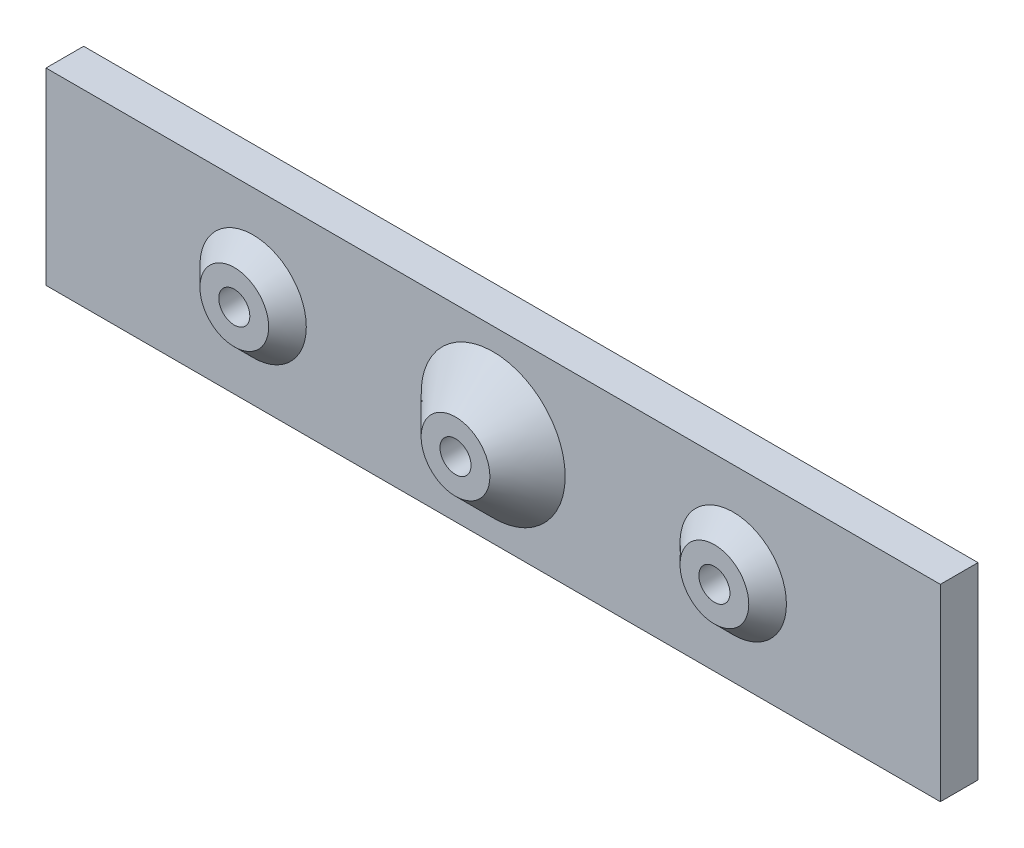
ISO-10303-21;
HEADER;
FILE_DESCRIPTION(('STEP AP214'),'2;1');
FILE_NAME('part.step','',(''),(''),'','','');
FILE_SCHEMA(('AUTOMOTIVE_DESIGN { 1 0 10303 214 1 1 1 1 }'));
ENDSEC;
DATA;
#1=APPLICATION_CONTEXT('core data for automotive mechanical design processes');
#2=APPLICATION_PROTOCOL_DEFINITION('international standard','automotive_design',2000,#1);
#3=PRODUCT_CONTEXT('',#1,'mechanical');
#4=PRODUCT('Part','Part','',(#3));
#5=PRODUCT_RELATED_PRODUCT_CATEGORY('part','',(#4));
#6=PRODUCT_DEFINITION_FORMATION('','',#4);
#7=PRODUCT_DEFINITION_CONTEXT('part definition',#1,'design');
#8=PRODUCT_DEFINITION('design','',#6,#7);
#9=PRODUCT_DEFINITION_SHAPE('','',#8);
#10=(LENGTH_UNIT() NAMED_UNIT(*) SI_UNIT(.MILLI.,.METRE.));
#11=(NAMED_UNIT(*) PLANE_ANGLE_UNIT() SI_UNIT($,.RADIAN.));
#12=(NAMED_UNIT(*) SI_UNIT($,.STERADIAN.) SOLID_ANGLE_UNIT());
#13=UNCERTAINTY_MEASURE_WITH_UNIT(LENGTH_MEASURE(1.E-05),#10,'distance_accuracy_value','');
#14=(GEOMETRIC_REPRESENTATION_CONTEXT(3) GLOBAL_UNCERTAINTY_ASSIGNED_CONTEXT((#13)) GLOBAL_UNIT_ASSIGNED_CONTEXT((#10,
#11,#12)) REPRESENTATION_CONTEXT('',''));
#15=CARTESIAN_POINT('',(0.,0.,0.));
#16=DIRECTION('',(0.,0.,1.));
#17=DIRECTION('',(1.,0.,0.));
#18=AXIS2_PLACEMENT_3D('',#15,#16,#17);
#19=CARTESIAN_POINT('',(0.,0.,4.));
#20=DIRECTION('',(0.,0.,1.));
#21=DIRECTION('',(1.,0.,0.));
#22=AXIS2_PLACEMENT_3D('',#19,#20,#21);
#23=PLANE('',#22);
#24=CARTESIAN_POINT('',(25.5,0.,4.));
#25=DIRECTION('',(0.,0.,1.));
#26=DIRECTION('',(1.,0.,0.));
#27=AXIS2_PLACEMENT_3D('',#24,#25,#26);
#28=CIRCLE('',#27,5.65);
#29=CARTESIAN_POINT('',(31.15,0.,4.));
#30=VERTEX_POINT('',#29);
#31=EDGE_CURVE('E202',#30,#30,#28,.T.);
#32=ORIENTED_EDGE('',*,*,#31,.F.);
#33=EDGE_LOOP('',(#32));
#34=FACE_BOUND('',#33,.T.);
#35=DIRECTION('',(0.,-1.,0.));
#36=VECTOR('',#35,1.);
#37=CARTESIAN_POINT('',(-47.5,-10.,4.));
#38=LINE('',#37,#36);
#39=CARTESIAN_POINT('',(-47.5,9.99999999999999,4.));
#40=VERTEX_POINT('',#39);
#41=CARTESIAN_POINT('',(-47.5,-10.,4.));
#42=VERTEX_POINT('',#41);
#43=EDGE_CURVE('E104',#40,#42,#38,.T.);
#44=ORIENTED_EDGE('',*,*,#43,.T.);
#45=DIRECTION('',(1.,0.,0.));
#46=VECTOR('',#45,1.);
#47=CARTESIAN_POINT('',(47.5,-9.99999999999999,4.));
#48=LINE('',#47,#46);
#49=CARTESIAN_POINT('',(47.5,-9.99999999999999,4.));
#50=VERTEX_POINT('',#49);
#51=EDGE_CURVE('E99',#42,#50,#48,.T.);
#52=ORIENTED_EDGE('',*,*,#51,.T.);
#53=DIRECTION('',(0.,1.,0.));
#54=VECTOR('',#53,1.);
#55=CARTESIAN_POINT('',(47.5,-9.99999999999999,4.));
#56=LINE('',#55,#54);
#57=CARTESIAN_POINT('',(47.5,10.,4.));
#58=VERTEX_POINT('',#57);
#59=EDGE_CURVE('E102',#50,#58,#56,.T.);
#60=ORIENTED_EDGE('',*,*,#59,.T.);
#61=DIRECTION('',(-1.,0.,0.));
#62=VECTOR('',#61,1.);
#63=CARTESIAN_POINT('',(47.5,10.,4.));
#64=LINE('',#63,#62);
#65=EDGE_CURVE('E68',#58,#40,#64,.T.);
#66=ORIENTED_EDGE('',*,*,#65,.T.);
#67=EDGE_LOOP('',(#44,#52,#60,#66));
#68=FACE_BOUND('',#67,.T.);
#69=CARTESIAN_POINT('',(-25.5,0.,4.));
#70=DIRECTION('',(0.,0.,1.));
#71=DIRECTION('',(1.,0.,0.));
#72=AXIS2_PLACEMENT_3D('',#69,#70,#71);
#73=CIRCLE('',#72,5.65);
#74=CARTESIAN_POINT('',(-19.85,0.,4.));
#75=VERTEX_POINT('',#74);
#76=EDGE_CURVE('E193',#75,#75,#73,.T.);
#77=ORIENTED_EDGE('',*,*,#76,.F.);
#78=EDGE_LOOP('',(#77));
#79=FACE_BOUND('',#78,.T.);
#80=CARTESIAN_POINT('',(0.,0.,4.));
#81=DIRECTION('',(0.,0.,1.));
#82=DIRECTION('',(1.,0.,0.));
#83=AXIS2_PLACEMENT_3D('',#80,#81,#82);
#84=CIRCLE('',#83,7.65);
#85=CARTESIAN_POINT('',(7.65000000000002,0.,4.));
#86=VERTEX_POINT('',#85);
#87=EDGE_CURVE('E208',#86,#86,#84,.T.);
#88=ORIENTED_EDGE('',*,*,#87,.F.);
#89=EDGE_LOOP('',(#88));
#90=FACE_BOUND('',#89,.T.);
#91=ADVANCED_FACE('F51',(#34,#68,#79,#90),#23,.T.);
#92=CARTESIAN_POINT('',(0.,0.,0.));
#93=DIRECTION('',(0.,0.,1.));
#94=DIRECTION('',(1.,0.,0.));
#95=AXIS2_PLACEMENT_3D('',#92,#93,#94);
#96=PLANE('',#95);
#97=DIRECTION('',(0.,-1.,0.));
#98=VECTOR('',#97,1.);
#99=CARTESIAN_POINT('',(-47.5,-10.,0.));
#100=LINE('',#99,#98);
#101=CARTESIAN_POINT('',(-47.5,9.99999999999999,0.));
#102=VERTEX_POINT('',#101);
#103=CARTESIAN_POINT('',(-47.5,-10.,0.));
#104=VERTEX_POINT('',#103);
#105=EDGE_CURVE('E119',#102,#104,#100,.T.);
#106=ORIENTED_EDGE('',*,*,#105,.F.);
#107=DIRECTION('',(-1.,0.,0.));
#108=VECTOR('',#107,1.);
#109=CARTESIAN_POINT('',(47.5,10.,0.));
#110=LINE('',#109,#108);
#111=CARTESIAN_POINT('',(47.5,10.,0.));
#112=VERTEX_POINT('',#111);
#113=EDGE_CURVE('E91',#112,#102,#110,.T.);
#114=ORIENTED_EDGE('',*,*,#113,.F.);
#115=DIRECTION('',(0.,1.,0.));
#116=VECTOR('',#115,1.);
#117=CARTESIAN_POINT('',(47.5,-9.99999999999999,0.));
#118=LINE('',#117,#116);
#119=CARTESIAN_POINT('',(47.5,-9.99999999999999,0.));
#120=VERTEX_POINT('',#119);
#121=EDGE_CURVE('E85',#120,#112,#118,.T.);
#122=ORIENTED_EDGE('',*,*,#121,.F.);
#123=DIRECTION('',(1.,0.,0.));
#124=VECTOR('',#123,1.);
#125=CARTESIAN_POINT('',(47.5,-9.99999999999999,0.));
#126=LINE('',#125,#124);
#127=EDGE_CURVE('E109',#104,#120,#126,.T.);
#128=ORIENTED_EDGE('',*,*,#127,.F.);
#129=EDGE_LOOP('',(#106,#114,#122,#128));
#130=FACE_BOUND('',#129,.T.);
#131=CARTESIAN_POINT('',(0.,0.,0.));
#132=DIRECTION('',(0.,0.,1.));
#133=DIRECTION('',(1.,0.,0.));
#134=AXIS2_PLACEMENT_3D('',#131,#132,#133);
#135=CIRCLE('',#134,1.65);
#136=CARTESIAN_POINT('',(1.65000000000002,0.,0.));
#137=VERTEX_POINT('',#136);
#138=EDGE_CURVE('E122',#137,#137,#135,.T.);
#139=ORIENTED_EDGE('',*,*,#138,.T.);
#140=EDGE_LOOP('',(#139));
#141=FACE_BOUND('',#140,.T.);
#142=CARTESIAN_POINT('',(25.5,0.,0.));
#143=DIRECTION('',(0.,0.,1.));
#144=DIRECTION('',(1.,0.,0.));
#145=AXIS2_PLACEMENT_3D('',#142,#143,#144);
#146=CIRCLE('',#145,1.65);
#147=CARTESIAN_POINT('',(27.15,0.,0.));
#148=VERTEX_POINT('',#147);
#149=EDGE_CURVE('E188',#148,#148,#146,.T.);
#150=ORIENTED_EDGE('',*,*,#149,.T.);
#151=EDGE_LOOP('',(#150));
#152=FACE_BOUND('',#151,.T.);
#153=CARTESIAN_POINT('',(-25.5,0.,0.));
#154=DIRECTION('',(0.,0.,1.));
#155=DIRECTION('',(1.,0.,0.));
#156=AXIS2_PLACEMENT_3D('',#153,#154,#155);
#157=CIRCLE('',#156,1.65);
#158=CARTESIAN_POINT('',(-23.85,0.,0.));
#159=VERTEX_POINT('',#158);
#160=EDGE_CURVE('E191',#159,#159,#157,.T.);
#161=ORIENTED_EDGE('',*,*,#160,.T.);
#162=EDGE_LOOP('',(#161));
#163=FACE_BOUND('',#162,.T.);
#164=ADVANCED_FACE('F154',(#130,#141,#152,#163),#96,.F.);
#165=CARTESIAN_POINT('',(-47.5,-10.,4.));
#166=DIRECTION('',(1.,0.,0.));
#167=DIRECTION('',(0.,0.,-1.));
#168=AXIS2_PLACEMENT_3D('',#165,#166,#167);
#169=PLANE('',#168);
#170=ORIENTED_EDGE('',*,*,#105,.T.);
#171=DIRECTION('',(0.,0.,-1.));
#172=VECTOR('',#171,1.);
#173=CARTESIAN_POINT('',(-47.5,-10.,4.));
#174=LINE('',#173,#172);
#175=EDGE_CURVE('E110',#42,#104,#174,.T.);
#176=ORIENTED_EDGE('',*,*,#175,.F.);
#177=ORIENTED_EDGE('',*,*,#43,.F.);
#178=DIRECTION('',(0.,0.,-1.));
#179=VECTOR('',#178,1.);
#180=CARTESIAN_POINT('',(-47.5,9.99999999999999,4.));
#181=LINE('',#180,#179);
#182=EDGE_CURVE('E115',#40,#102,#181,.T.);
#183=ORIENTED_EDGE('',*,*,#182,.T.);
#184=EDGE_LOOP('',(#170,#176,#177,#183));
#185=FACE_BOUND('',#184,.T.);
#186=ADVANCED_FACE('F161',(#185),#169,.F.);
#187=CARTESIAN_POINT('',(47.5,-9.99999999999999,4.));
#188=DIRECTION('',(0.,1.,0.));
#189=DIRECTION('',(-1.,0.,0.));
#190=AXIS2_PLACEMENT_3D('',#187,#188,#189);
#191=PLANE('',#190);
#192=ORIENTED_EDGE('',*,*,#127,.T.);
#193=DIRECTION('',(0.,0.,-1.));
#194=VECTOR('',#193,1.);
#195=CARTESIAN_POINT('',(47.5,-9.99999999999999,4.));
#196=LINE('',#195,#194);
#197=EDGE_CURVE('E107',#50,#120,#196,.T.);
#198=ORIENTED_EDGE('',*,*,#197,.F.);
#199=ORIENTED_EDGE('',*,*,#51,.F.);
#200=ORIENTED_EDGE('',*,*,#175,.T.);
#201=EDGE_LOOP('',(#192,#198,#199,#200));
#202=FACE_BOUND('',#201,.T.);
#203=ADVANCED_FACE('F108',(#202),#191,.F.);
#204=CARTESIAN_POINT('',(47.5,-9.99999999999999,4.));
#205=DIRECTION('',(-1.,0.,0.));
#206=DIRECTION('',(0.,0.,1.));
#207=AXIS2_PLACEMENT_3D('',#204,#205,#206);
#208=PLANE('',#207);
#209=ORIENTED_EDGE('',*,*,#121,.T.);
#210=DIRECTION('',(0.,0.,-1.));
#211=VECTOR('',#210,1.);
#212=CARTESIAN_POINT('',(47.5,10.,4.));
#213=LINE('',#212,#211);
#214=EDGE_CURVE('E111',#58,#112,#213,.T.);
#215=ORIENTED_EDGE('',*,*,#214,.F.);
#216=ORIENTED_EDGE('',*,*,#59,.F.);
#217=ORIENTED_EDGE('',*,*,#197,.T.);
#218=EDGE_LOOP('',(#209,#215,#216,#217));
#219=FACE_BOUND('',#218,.T.);
#220=ADVANCED_FACE('F113',(#219),#208,.F.);
#221=CARTESIAN_POINT('',(47.5,10.,4.));
#222=DIRECTION('',(0.,-1.,0.));
#223=DIRECTION('',(1.,0.,0.));
#224=AXIS2_PLACEMENT_3D('',#221,#222,#223);
#225=PLANE('',#224);
#226=ORIENTED_EDGE('',*,*,#113,.T.);
#227=ORIENTED_EDGE('',*,*,#182,.F.);
#228=ORIENTED_EDGE('',*,*,#65,.F.);
#229=ORIENTED_EDGE('',*,*,#214,.T.);
#230=EDGE_LOOP('',(#226,#227,#228,#229));
#231=FACE_BOUND('',#230,.T.);
#232=ADVANCED_FACE('F169',(#231),#225,.F.);
#233=CARTESIAN_POINT('',(0.,0.,4.));
#234=DIRECTION('',(0.,0.,-1.));
#235=DIRECTION('',(-1.,0.,0.));
#236=AXIS2_PLACEMENT_3D('',#233,#234,#235);
#237=CYLINDRICAL_SURFACE('',#236,1.65);
#238=ORIENTED_EDGE('',*,*,#138,.F.);
#239=EDGE_LOOP('',(#238));
#240=FACE_BOUND('',#239,.T.);
#241=CARTESIAN_POINT('',(0.,0.,8.));
#242=DIRECTION('',(0.,0.,1.));
#243=DIRECTION('',(1.,0.,0.));
#244=AXIS2_PLACEMENT_3D('',#241,#242,#243);
#245=CIRCLE('',#244,1.65);
#246=CARTESIAN_POINT('',(1.65000000000002,0.,8.));
#247=VERTEX_POINT('',#246);
#248=EDGE_CURVE('E211',#247,#247,#245,.T.);
#249=ORIENTED_EDGE('',*,*,#248,.T.);
#250=EDGE_LOOP('',(#249));
#251=FACE_BOUND('',#250,.T.);
#252=ADVANCED_FACE('F166',(#240,#251),#237,.F.);
#253=CARTESIAN_POINT('',(25.5,0.,4.));
#254=DIRECTION('',(0.,0.,-1.));
#255=DIRECTION('',(-1.,0.,0.));
#256=AXIS2_PLACEMENT_3D('',#253,#254,#255);
#257=CYLINDRICAL_SURFACE('',#256,1.65);
#258=ORIENTED_EDGE('',*,*,#149,.F.);
#259=EDGE_LOOP('',(#258));
#260=FACE_BOUND('',#259,.T.);
#261=CARTESIAN_POINT('',(25.5,0.,6.));
#262=DIRECTION('',(0.,0.,1.));
#263=DIRECTION('',(1.,0.,0.));
#264=AXIS2_PLACEMENT_3D('',#261,#262,#263);
#265=CIRCLE('',#264,1.65);
#266=CARTESIAN_POINT('',(27.15,0.,6.));
#267=VERTEX_POINT('',#266);
#268=EDGE_CURVE('E205',#267,#267,#265,.T.);
#269=ORIENTED_EDGE('',*,*,#268,.T.);
#270=EDGE_LOOP('',(#269));
#271=FACE_BOUND('',#270,.T.);
#272=ADVANCED_FACE('F217',(#260,#271),#257,.F.);
#273=CARTESIAN_POINT('',(-25.5,0.,4.));
#274=DIRECTION('',(0.,0.,-1.));
#275=DIRECTION('',(-1.,0.,0.));
#276=AXIS2_PLACEMENT_3D('',#273,#274,#275);
#277=CYLINDRICAL_SURFACE('',#276,1.65);
#278=ORIENTED_EDGE('',*,*,#160,.F.);
#279=EDGE_LOOP('',(#278));
#280=FACE_BOUND('',#279,.T.);
#281=CARTESIAN_POINT('',(-25.5,0.,6.));
#282=DIRECTION('',(0.,0.,1.));
#283=DIRECTION('',(1.,0.,0.));
#284=AXIS2_PLACEMENT_3D('',#281,#282,#283);
#285=CIRCLE('',#284,1.65);
#286=CARTESIAN_POINT('',(-23.85,0.,6.));
#287=VERTEX_POINT('',#286);
#288=EDGE_CURVE('E196',#287,#287,#285,.T.);
#289=ORIENTED_EDGE('',*,*,#288,.T.);
#290=EDGE_LOOP('',(#289));
#291=FACE_BOUND('',#290,.T.);
#292=ADVANCED_FACE('F221',(#280,#291),#277,.F.);
#293=CARTESIAN_POINT('',(-25.5,0.,6.));
#294=DIRECTION('',(0.,0.,1.));
#295=DIRECTION('',(1.,0.,0.));
#296=AXIS2_PLACEMENT_3D('',#293,#294,#295);
#297=PLANE('',#296);
#298=CARTESIAN_POINT('',(-25.5,0.,6.));
#299=DIRECTION('',(0.,0.,1.));
#300=DIRECTION('',(1.,0.,0.));
#301=AXIS2_PLACEMENT_3D('',#298,#299,#300);
#302=CIRCLE('',#301,3.65);
#303=CARTESIAN_POINT('',(-21.85,0.,6.));
#304=VERTEX_POINT('',#303);
#305=EDGE_CURVE('E60',#304,#304,#302,.T.);
#306=ORIENTED_EDGE('',*,*,#305,.T.);
#307=EDGE_LOOP('',(#306));
#308=FACE_BOUND('',#307,.T.);
#309=ORIENTED_EDGE('',*,*,#288,.F.);
#310=EDGE_LOOP('',(#309));
#311=FACE_BOUND('',#310,.T.);
#312=ADVANCED_FACE('F134',(#308,#311),#297,.T.);
#313=CARTESIAN_POINT('',(25.5,0.,6.));
#314=DIRECTION('',(0.,0.,1.));
#315=DIRECTION('',(1.,0.,0.));
#316=AXIS2_PLACEMENT_3D('',#313,#314,#315);
#317=PLANE('',#316);
#318=CARTESIAN_POINT('',(25.5,0.,6.));
#319=DIRECTION('',(0.,0.,1.));
#320=DIRECTION('',(1.,0.,0.));
#321=AXIS2_PLACEMENT_3D('',#318,#319,#320);
#322=CIRCLE('',#321,3.65);
#323=CARTESIAN_POINT('',(29.15,0.,6.));
#324=VERTEX_POINT('',#323);
#325=EDGE_CURVE('E129',#324,#324,#322,.T.);
#326=ORIENTED_EDGE('',*,*,#325,.T.);
#327=EDGE_LOOP('',(#326));
#328=FACE_BOUND('',#327,.T.);
#329=ORIENTED_EDGE('',*,*,#268,.F.);
#330=EDGE_LOOP('',(#329));
#331=FACE_BOUND('',#330,.T.);
#332=ADVANCED_FACE('F149',(#328,#331),#317,.T.);
#333=CARTESIAN_POINT('',(25.5,0.,6.));
#334=DIRECTION('',(0.,0.,-1.));
#335=DIRECTION('',(-1.,0.,0.));
#336=AXIS2_PLACEMENT_3D('',#333,#334,#335);
#337=CONICAL_SURFACE('',#336,3.65,0.785398163397447);
#338=ORIENTED_EDGE('',*,*,#31,.T.);
#339=EDGE_LOOP('',(#338));
#340=FACE_BOUND('',#339,.T.);
#341=ORIENTED_EDGE('',*,*,#325,.F.);
#342=EDGE_LOOP('',(#341));
#343=FACE_BOUND('',#342,.T.);
#344=ADVANCED_FACE('F140',(#340,#343),#337,.T.);
#345=CARTESIAN_POINT('',(-25.5,0.,6.));
#346=DIRECTION('',(0.,0.,-1.));
#347=DIRECTION('',(-1.,0.,0.));
#348=AXIS2_PLACEMENT_3D('',#345,#346,#347);
#349=CONICAL_SURFACE('',#348,3.65,0.785398163397447);
#350=ORIENTED_EDGE('',*,*,#76,.T.);
#351=EDGE_LOOP('',(#350));
#352=FACE_BOUND('',#351,.T.);
#353=ORIENTED_EDGE('',*,*,#305,.F.);
#354=EDGE_LOOP('',(#353));
#355=FACE_BOUND('',#354,.T.);
#356=ADVANCED_FACE('F137',(#352,#355),#349,.T.);
#357=CARTESIAN_POINT('',(0.,0.,8.));
#358=DIRECTION('',(0.,0.,1.));
#359=DIRECTION('',(1.,0.,0.));
#360=AXIS2_PLACEMENT_3D('',#357,#358,#359);
#361=PLANE('',#360);
#362=CARTESIAN_POINT('',(0.,0.,8.));
#363=DIRECTION('',(0.,0.,1.));
#364=DIRECTION('',(1.,0.,0.));
#365=AXIS2_PLACEMENT_3D('',#362,#363,#364);
#366=CIRCLE('',#365,3.64999999999999);
#367=CARTESIAN_POINT('',(3.65000000000001,0.,8.));
#368=VERTEX_POINT('',#367);
#369=EDGE_CURVE('E12',#368,#368,#366,.T.);
#370=ORIENTED_EDGE('',*,*,#369,.T.);
#371=EDGE_LOOP('',(#370));
#372=FACE_BOUND('',#371,.T.);
#373=ORIENTED_EDGE('',*,*,#248,.F.);
#374=EDGE_LOOP('',(#373));
#375=FACE_BOUND('',#374,.T.);
#376=ADVANCED_FACE('F139',(#372,#375),#361,.T.);
#377=CARTESIAN_POINT('',(0.,0.,8.));
#378=DIRECTION('',(0.,0.,-1.));
#379=DIRECTION('',(-1.,0.,0.));
#380=AXIS2_PLACEMENT_3D('',#377,#378,#379);
#381=CONICAL_SURFACE('',#380,3.64999999999999,0.785398163397447);
#382=ORIENTED_EDGE('',*,*,#87,.T.);
#383=EDGE_LOOP('',(#382));
#384=FACE_BOUND('',#383,.T.);
#385=ORIENTED_EDGE('',*,*,#369,.F.);
#386=EDGE_LOOP('',(#385));
#387=FACE_BOUND('',#386,.T.);
#388=ADVANCED_FACE('F53',(#384,#387),#381,.T.);
#389=CLOSED_SHELL('',(#91,#164,#186,#203,#220,#232,#252,#272,#292,#312,#332,#344,#356,#376,#388));
#390=MANIFOLD_SOLID_BREP('B2',#389);
#391=ADVANCED_BREP_SHAPE_REPRESENTATION('',(#18,#390),#14);
#392=SHAPE_DEFINITION_REPRESENTATION(#9,#391);
ENDSEC;
END-ISO-10303-21;
